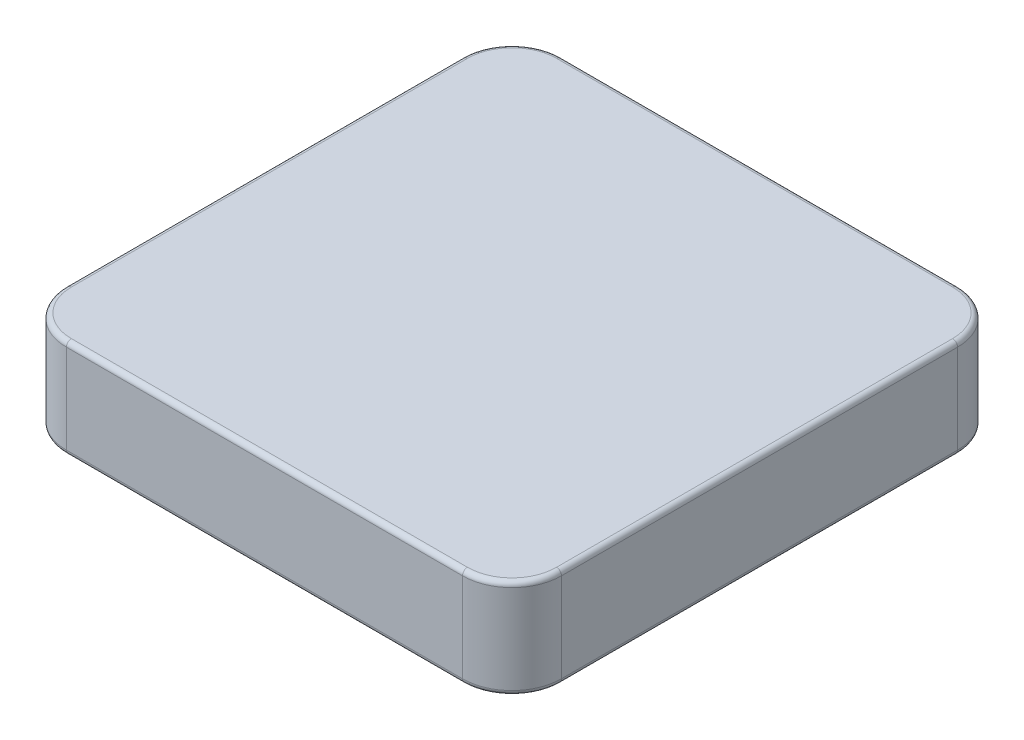
ISO-10303-21;
HEADER;
FILE_DESCRIPTION(('STEP AP214'),'2;1');
FILE_NAME('part.step','',(''),(''),'','','');
FILE_SCHEMA(('AUTOMOTIVE_DESIGN { 1 0 10303 214 1 1 1 1 }'));
ENDSEC;
DATA;
#1=APPLICATION_CONTEXT('core data for automotive mechanical design processes');
#2=APPLICATION_PROTOCOL_DEFINITION('international standard','automotive_design',2000,#1);
#3=PRODUCT_CONTEXT('',#1,'mechanical');
#4=PRODUCT('Part','Part','',(#3));
#5=PRODUCT_RELATED_PRODUCT_CATEGORY('part','',(#4));
#6=PRODUCT_DEFINITION_FORMATION('','',#4);
#7=PRODUCT_DEFINITION_CONTEXT('part definition',#1,'design');
#8=PRODUCT_DEFINITION('design','',#6,#7);
#9=PRODUCT_DEFINITION_SHAPE('','',#8);
#10=(LENGTH_UNIT() NAMED_UNIT(*) SI_UNIT(.MILLI.,.METRE.));
#11=(NAMED_UNIT(*) PLANE_ANGLE_UNIT() SI_UNIT($,.RADIAN.));
#12=(NAMED_UNIT(*) SI_UNIT($,.STERADIAN.) SOLID_ANGLE_UNIT());
#13=UNCERTAINTY_MEASURE_WITH_UNIT(LENGTH_MEASURE(1.E-05),#10,'distance_accuracy_value','');
#14=(GEOMETRIC_REPRESENTATION_CONTEXT(3) GLOBAL_UNCERTAINTY_ASSIGNED_CONTEXT((#13)) GLOBAL_UNIT_ASSIGNED_CONTEXT((#10,
#11,#12)) REPRESENTATION_CONTEXT('',''));
#15=CARTESIAN_POINT('',(0.,0.,0.));
#16=DIRECTION('',(0.,0.,1.));
#17=DIRECTION('',(1.,0.,0.));
#18=AXIS2_PLACEMENT_3D('',#15,#16,#17);
#19=CARTESIAN_POINT('',(9.99999999999997,10.0000000000002,89.9999999999999));
#20=DIRECTION('',(0.,-0.999999999999999,0.));
#21=DIRECTION('',(0.,0.,-0.999999999999999));
#22=AXIS2_PLACEMENT_3D('',#19,#20,#21);
#23=CYLINDRICAL_SURFACE('',#22,10.);
#24=DIRECTION('',(0.,-0.999999999999999,0.));
#25=VECTOR('',#24,1.);
#26=CARTESIAN_POINT('',(10.0000000000001,9.99999999999997,100.));
#27=LINE('',#26,#25);
#28=CARTESIAN_POINT('',(10.0000000000001,8.99999999999996,100.));
#29=VERTEX_POINT('',#28);
#30=CARTESIAN_POINT('',(10.0000000000001,-8.99999999999998,100.));
#31=VERTEX_POINT('',#30);
#32=EDGE_CURVE('E199',#29,#31,#27,.T.);
#33=ORIENTED_EDGE('',*,*,#32,.F.);
#34=CARTESIAN_POINT('',(9.99999999999999,9.00000000000004,90.));
#35=DIRECTION('',(0.,-0.999999999999999,0.));
#36=DIRECTION('',(0.,0.,-0.999999999999999));
#37=AXIS2_PLACEMENT_3D('',#34,#35,#36);
#38=CIRCLE('',#37,10.);
#39=CARTESIAN_POINT('',(0.,9.00000000000001,89.9999999999999));
#40=VERTEX_POINT('',#39);
#41=EDGE_CURVE('E271',#29,#40,#38,.T.);
#42=ORIENTED_EDGE('',*,*,#41,.T.);
#43=DIRECTION('',(0.,-0.999999999999999,0.));
#44=VECTOR('',#43,1.);
#45=CARTESIAN_POINT('',(0.,10.,89.9999999999999));
#46=LINE('',#45,#44);
#47=CARTESIAN_POINT('',(0.,-8.99999999999995,89.9999999999999));
#48=VERTEX_POINT('',#47);
#49=EDGE_CURVE('E251',#40,#48,#46,.T.);
#50=ORIENTED_EDGE('',*,*,#49,.T.);
#51=CARTESIAN_POINT('',(10.,-8.99999999999988,90.));
#52=DIRECTION('',(0.,-0.999999999999999,0.));
#53=DIRECTION('',(0.,0.,-0.999999999999999));
#54=AXIS2_PLACEMENT_3D('',#51,#52,#53);
#55=CIRCLE('',#54,10.);
#56=EDGE_CURVE('E220',#48,#31,#55,.F.);
#57=ORIENTED_EDGE('',*,*,#56,.T.);
#58=EDGE_LOOP('',(#33,#42,#50,#57));
#59=FACE_BOUND('',#58,.T.);
#60=ADVANCED_FACE('F51',(#59),#23,.T.);
#61=CARTESIAN_POINT('',(10.0000000000001,9.99999999999997,100.));
#62=DIRECTION('',(0.,0.,-0.999999999999999));
#63=DIRECTION('',(-0.999999999999999,0.,0.));
#64=AXIS2_PLACEMENT_3D('',#61,#62,#63);
#65=PLANE('',#64);
#66=DIRECTION('',(0.,-0.999999999999999,0.));
#67=VECTOR('',#66,1.);
#68=CARTESIAN_POINT('',(89.9999999999999,9.99999999999999,100.));
#69=LINE('',#68,#67);
#70=CARTESIAN_POINT('',(89.9999999999998,9.00000000000014,100.));
#71=VERTEX_POINT('',#70);
#72=CARTESIAN_POINT('',(89.9999999999998,-9.,100.));
#73=VERTEX_POINT('',#72);
#74=EDGE_CURVE('E172',#71,#73,#69,.T.);
#75=ORIENTED_EDGE('',*,*,#74,.F.);
#76=DIRECTION('',(0.999999999999999,0.,0.));
#77=VECTOR('',#76,1.);
#78=CARTESIAN_POINT('',(10.0000000000001,8.99999999999996,100.));
#79=LINE('',#78,#77);
#80=EDGE_CURVE('E268',#71,#29,#79,.F.);
#81=ORIENTED_EDGE('',*,*,#80,.T.);
#82=ORIENTED_EDGE('',*,*,#32,.T.);
#83=DIRECTION('',(0.999999999999999,0.,0.));
#84=VECTOR('',#83,1.);
#85=CARTESIAN_POINT('',(89.9999999999998,-9.,100.));
#86=LINE('',#85,#84);
#87=EDGE_CURVE('E218',#31,#73,#86,.T.);
#88=ORIENTED_EDGE('',*,*,#87,.T.);
#89=EDGE_LOOP('',(#75,#81,#82,#88));
#90=FACE_BOUND('',#89,.T.);
#91=ADVANCED_FACE('F348',(#90),#65,.F.);
#92=CARTESIAN_POINT('',(89.9999999999999,10.0000000000001,90.));
#93=DIRECTION('',(0.,-0.999999999999999,0.));
#94=DIRECTION('',(0.,0.,-0.999999999999999));
#95=AXIS2_PLACEMENT_3D('',#92,#93,#94);
#96=CYLINDRICAL_SURFACE('',#95,9.99999999999999);
#97=DIRECTION('',(0.,-0.999999999999999,0.));
#98=VECTOR('',#97,1.);
#99=CARTESIAN_POINT('',(99.9999999999999,9.99999999999995,89.9999999999998));
#100=LINE('',#99,#98);
#101=CARTESIAN_POINT('',(99.9999999999999,9.00000000000001,89.9999999999999));
#102=VERTEX_POINT('',#101);
#103=CARTESIAN_POINT('',(99.9999999999999,-8.99999999999999,89.9999999999999));
#104=VERTEX_POINT('',#103);
#105=EDGE_CURVE('E163',#102,#104,#100,.T.);
#106=ORIENTED_EDGE('',*,*,#105,.F.);
#107=CARTESIAN_POINT('',(89.9999999999999,9.00000000000011,89.9999999999998));
#108=DIRECTION('',(0.,-0.999999999999999,0.));
#109=DIRECTION('',(0.,0.,-0.999999999999999));
#110=AXIS2_PLACEMENT_3D('',#107,#108,#109);
#111=CIRCLE('',#110,9.99999999999999);
#112=EDGE_CURVE('E13',#102,#71,#111,.T.);
#113=ORIENTED_EDGE('',*,*,#112,.T.);
#114=ORIENTED_EDGE('',*,*,#74,.T.);
#115=CARTESIAN_POINT('',(90.,-8.99999999999997,89.9999999999998));
#116=DIRECTION('',(0.,-0.999999999999999,0.));
#117=DIRECTION('',(0.,0.,-0.999999999999999));
#118=AXIS2_PLACEMENT_3D('',#115,#116,#117);
#119=CIRCLE('',#118,9.99999999999999);
#120=EDGE_CURVE('E181',#73,#104,#119,.F.);
#121=ORIENTED_EDGE('',*,*,#120,.T.);
#122=EDGE_LOOP('',(#106,#113,#114,#121));
#123=FACE_BOUND('',#122,.T.);
#124=ADVANCED_FACE('F195',(#123),#96,.T.);
#125=CARTESIAN_POINT('',(99.9999999999999,10.0000000000002,10.0000000000001));
#126=DIRECTION('',(-0.999999999999999,0.,0.));
#127=DIRECTION('',(0.,0.,0.999999999999999));
#128=AXIS2_PLACEMENT_3D('',#125,#126,#127);
#129=PLANE('',#128);
#130=DIRECTION('',(0.,-0.999999999999999,0.));
#131=VECTOR('',#130,1.);
#132=CARTESIAN_POINT('',(99.9999999999999,10.0000000000002,10.0000000000001));
#133=LINE('',#132,#131);
#134=CARTESIAN_POINT('',(99.9999999999999,9.00000000000006,10.0000000000001));
#135=VERTEX_POINT('',#134);
#136=CARTESIAN_POINT('',(99.9999999999998,-8.99999999999987,10.0000000000001));
#137=VERTEX_POINT('',#136);
#138=EDGE_CURVE('E173',#135,#137,#133,.T.);
#139=ORIENTED_EDGE('',*,*,#138,.F.);
#140=DIRECTION('',(0.,0.,-0.999999999999999));
#141=VECTOR('',#140,1.);
#142=CARTESIAN_POINT('',(99.9999999999999,9.00000000000006,10.0000000000001));
#143=LINE('',#142,#141);
#144=EDGE_CURVE('E60',#135,#102,#143,.F.);
#145=ORIENTED_EDGE('',*,*,#144,.T.);
#146=ORIENTED_EDGE('',*,*,#105,.T.);
#147=DIRECTION('',(0.,0.,-0.999999999999999));
#148=VECTOR('',#147,1.);
#149=CARTESIAN_POINT('',(99.9999999999998,-8.99999999999987,10.0000000000001));
#150=LINE('',#149,#148);
#151=EDGE_CURVE('E167',#104,#137,#150,.T.);
#152=ORIENTED_EDGE('',*,*,#151,.T.);
#153=EDGE_LOOP('',(#139,#145,#146,#152));
#154=FACE_BOUND('',#153,.T.);
#155=ADVANCED_FACE('F165',(#154),#129,.F.);
#156=CARTESIAN_POINT('',(89.9999999999999,10.,10.));
#157=DIRECTION('',(0.,-0.999999999999999,0.));
#158=DIRECTION('',(0.,0.,-0.999999999999999));
#159=AXIS2_PLACEMENT_3D('',#156,#157,#158);
#160=CYLINDRICAL_SURFACE('',#159,10.);
#161=DIRECTION('',(0.,-0.999999999999999,0.));
#162=VECTOR('',#161,1.);
#163=CARTESIAN_POINT('',(89.9999999999998,10.0000000000001,0.));
#164=LINE('',#163,#162);
#165=CARTESIAN_POINT('',(89.9999999999999,9.00000000000006,0.));
#166=VERTEX_POINT('',#165);
#167=CARTESIAN_POINT('',(89.9999999999998,-8.99999999999981,0.));
#168=VERTEX_POINT('',#167);
#169=EDGE_CURVE('E314',#166,#168,#164,.T.);
#170=ORIENTED_EDGE('',*,*,#169,.F.);
#171=CARTESIAN_POINT('',(89.9999999999999,9.00000000000004,9.99999999999998));
#172=DIRECTION('',(0.,-0.999999999999999,0.));
#173=DIRECTION('',(0.,0.,-0.999999999999999));
#174=AXIS2_PLACEMENT_3D('',#171,#172,#173);
#175=CIRCLE('',#174,10.);
#176=EDGE_CURVE('E75',#166,#135,#175,.T.);
#177=ORIENTED_EDGE('',*,*,#176,.T.);
#178=ORIENTED_EDGE('',*,*,#138,.T.);
#179=CARTESIAN_POINT('',(89.9999999999999,-8.99999999999984,10.));
#180=DIRECTION('',(0.,-0.999999999999999,0.));
#181=DIRECTION('',(0.,0.,-0.999999999999999));
#182=AXIS2_PLACEMENT_3D('',#179,#180,#181);
#183=CIRCLE('',#182,10.);
#184=EDGE_CURVE('E193',#137,#168,#183,.F.);
#185=ORIENTED_EDGE('',*,*,#184,.T.);
#186=EDGE_LOOP('',(#170,#177,#178,#185));
#187=FACE_BOUND('',#186,.T.);
#188=ADVANCED_FACE('F316',(#187),#160,.T.);
#189=CARTESIAN_POINT('',(10.0000000000001,10.,0.));
#190=DIRECTION('',(0.,0.,0.999999999999999));
#191=DIRECTION('',(0.999999999999999,0.,0.));
#192=AXIS2_PLACEMENT_3D('',#189,#190,#191);
#193=PLANE('',#192);
#194=DIRECTION('',(0.,-0.999999999999999,0.));
#195=VECTOR('',#194,1.);
#196=CARTESIAN_POINT('',(10.0000000000001,10.,0.));
#197=LINE('',#196,#195);
#198=CARTESIAN_POINT('',(10.0000000000001,9.,0.));
#199=VERTEX_POINT('',#198);
#200=CARTESIAN_POINT('',(10.,-8.99999999999993,0.));
#201=VERTEX_POINT('',#200);
#202=EDGE_CURVE('E315',#199,#201,#197,.T.);
#203=ORIENTED_EDGE('',*,*,#202,.F.);
#204=DIRECTION('',(-0.999999999999999,0.,0.));
#205=VECTOR('',#204,1.);
#206=CARTESIAN_POINT('',(10.0000000000001,9.,0.));
#207=LINE('',#206,#205);
#208=EDGE_CURVE('E277',#199,#166,#207,.F.);
#209=ORIENTED_EDGE('',*,*,#208,.T.);
#210=ORIENTED_EDGE('',*,*,#169,.T.);
#211=DIRECTION('',(-0.999999999999999,0.,0.));
#212=VECTOR('',#211,1.);
#213=CARTESIAN_POINT('',(10.,-8.99999999999993,0.));
#214=LINE('',#213,#212);
#215=EDGE_CURVE('E229',#168,#201,#214,.T.);
#216=ORIENTED_EDGE('',*,*,#215,.T.);
#217=EDGE_LOOP('',(#203,#209,#210,#216));
#218=FACE_BOUND('',#217,.T.);
#219=ADVANCED_FACE('F313',(#218),#193,.F.);
#220=CARTESIAN_POINT('',(10.,10.0000000000001,10.));
#221=DIRECTION('',(0.,-0.999999999999999,0.));
#222=DIRECTION('',(0.,0.,-0.999999999999999));
#223=AXIS2_PLACEMENT_3D('',#220,#221,#222);
#224=CYLINDRICAL_SURFACE('',#223,10.);
#225=DIRECTION('',(0.,-0.999999999999999,0.));
#226=VECTOR('',#225,1.);
#227=CARTESIAN_POINT('',(0.,10.,10.0000000000001));
#228=LINE('',#227,#226);
#229=CARTESIAN_POINT('',(0.,9.00000000000001,10.0000000000001));
#230=VERTEX_POINT('',#229);
#231=CARTESIAN_POINT('',(0.,-8.99999999999988,10.0000000000001));
#232=VERTEX_POINT('',#231);
#233=EDGE_CURVE('E320',#230,#232,#228,.T.);
#234=ORIENTED_EDGE('',*,*,#233,.F.);
#235=CARTESIAN_POINT('',(9.99999999999999,9.,10.));
#236=DIRECTION('',(0.,-0.999999999999999,0.));
#237=DIRECTION('',(0.,0.,-0.999999999999999));
#238=AXIS2_PLACEMENT_3D('',#235,#236,#237);
#239=CIRCLE('',#238,10.);
#240=EDGE_CURVE('E275',#230,#199,#239,.T.);
#241=ORIENTED_EDGE('',*,*,#240,.T.);
#242=ORIENTED_EDGE('',*,*,#202,.T.);
#243=CARTESIAN_POINT('',(9.99999999999999,-8.99999999999993,10.0000000000001));
#244=DIRECTION('',(0.,-0.999999999999999,0.));
#245=DIRECTION('',(0.,0.,-0.999999999999999));
#246=AXIS2_PLACEMENT_3D('',#243,#244,#245);
#247=CIRCLE('',#246,10.);
#248=EDGE_CURVE('E226',#201,#232,#247,.F.);
#249=ORIENTED_EDGE('',*,*,#248,.T.);
#250=EDGE_LOOP('',(#234,#241,#242,#249));
#251=FACE_BOUND('',#250,.T.);
#252=ADVANCED_FACE('F370',(#251),#224,.T.);
#253=CARTESIAN_POINT('',(0.,10.0000000000001,10.));
#254=DIRECTION('',(0.999999999999999,0.,0.));
#255=DIRECTION('',(0.,0.,-0.999999999999999));
#256=AXIS2_PLACEMENT_3D('',#253,#254,#255);
#257=PLANE('',#256);
#258=ORIENTED_EDGE('',*,*,#49,.F.);
#259=DIRECTION('',(0.,0.,0.999999999999999));
#260=VECTOR('',#259,1.);
#261=CARTESIAN_POINT('',(0.,9.00000000000001,10.0000000000001));
#262=LINE('',#261,#260);
#263=EDGE_CURVE('E273',#40,#230,#262,.F.);
#264=ORIENTED_EDGE('',*,*,#263,.T.);
#265=ORIENTED_EDGE('',*,*,#233,.T.);
#266=DIRECTION('',(0.,0.,0.999999999999999));
#267=VECTOR('',#266,1.);
#268=CARTESIAN_POINT('',(0.,-8.99999999999995,89.9999999999999));
#269=LINE('',#268,#267);
#270=EDGE_CURVE('E223',#232,#48,#269,.T.);
#271=ORIENTED_EDGE('',*,*,#270,.T.);
#272=EDGE_LOOP('',(#258,#264,#265,#271));
#273=FACE_BOUND('',#272,.T.);
#274=ADVANCED_FACE('F334',(#273),#257,.F.);
#275=CARTESIAN_POINT('',(9.99999999999997,10.0000000000002,89.9999999999999));
#276=DIRECTION('',(0.,-0.999999999999999,0.));
#277=DIRECTION('',(0.,0.,-0.999999999999999));
#278=AXIS2_PLACEMENT_3D('',#275,#276,#277);
#279=PLANE('',#278);
#280=CARTESIAN_POINT('',(9.99999999999997,10.0000000000002,89.9999999999999));
#281=DIRECTION('',(0.,-0.999999999999999,0.));
#282=DIRECTION('',(0.,0.,-0.999999999999999));
#283=AXIS2_PLACEMENT_3D('',#280,#281,#282);
#284=CIRCLE('',#283,9.);
#285=CARTESIAN_POINT('',(0.999999999999945,10.0000000000002,89.9999999999997));
#286=VERTEX_POINT('',#285);
#287=CARTESIAN_POINT('',(10.0000000000001,9.99999999999997,99.));
#288=VERTEX_POINT('',#287);
#289=EDGE_CURVE('E263',#286,#288,#284,.F.);
#290=ORIENTED_EDGE('',*,*,#289,.T.);
#291=DIRECTION('',(0.999999999999999,0.,0.));
#292=VECTOR('',#291,1.);
#293=CARTESIAN_POINT('',(9.99999999999997,10.0000000000001,98.9999999999997));
#294=LINE('',#293,#292);
#295=CARTESIAN_POINT('',(89.9999999999998,10.,99.));
#296=VERTEX_POINT('',#295);
#297=EDGE_CURVE('E265',#288,#296,#294,.T.);
#298=ORIENTED_EDGE('',*,*,#297,.T.);
#299=CARTESIAN_POINT('',(89.9999999999999,10.0000000000001,90.));
#300=DIRECTION('',(0.,-0.999999999999999,0.));
#301=DIRECTION('',(0.,0.,-0.999999999999999));
#302=AXIS2_PLACEMENT_3D('',#299,#300,#301);
#303=CIRCLE('',#302,8.99999999999999);
#304=CARTESIAN_POINT('',(98.9999999999999,10.0000000000001,89.9999999999998));
#305=VERTEX_POINT('',#304);
#306=EDGE_CURVE('E192',#296,#305,#303,.F.);
#307=ORIENTED_EDGE('',*,*,#306,.T.);
#308=DIRECTION('',(0.,0.,-0.999999999999999));
#309=VECTOR('',#308,1.);
#310=CARTESIAN_POINT('',(98.9999999999998,10.0000000000001,89.9999999999999));
#311=LINE('',#310,#309);
#312=CARTESIAN_POINT('',(98.9999999999999,9.99999999999998,10.0000000000001));
#313=VERTEX_POINT('',#312);
#314=EDGE_CURVE('E253',#305,#313,#311,.T.);
#315=ORIENTED_EDGE('',*,*,#314,.T.);
#316=CARTESIAN_POINT('',(89.9999999999999,10.,10.));
#317=DIRECTION('',(0.,-0.999999999999999,0.));
#318=DIRECTION('',(0.,0.,-0.999999999999999));
#319=AXIS2_PLACEMENT_3D('',#316,#317,#318);
#320=CIRCLE('',#319,9.);
#321=CARTESIAN_POINT('',(89.9999999999999,10.0000000000001,1.00000000000003));
#322=VERTEX_POINT('',#321);
#323=EDGE_CURVE('E255',#313,#322,#320,.F.);
#324=ORIENTED_EDGE('',*,*,#323,.T.);
#325=DIRECTION('',(-0.999999999999999,0.,0.));
#326=VECTOR('',#325,1.);
#327=CARTESIAN_POINT('',(10.,10.0000000000001,1.));
#328=LINE('',#327,#326);
#329=CARTESIAN_POINT('',(10.0000000000001,10.0000000000001,1.));
#330=VERTEX_POINT('',#329);
#331=EDGE_CURVE('E257',#322,#330,#328,.T.);
#332=ORIENTED_EDGE('',*,*,#331,.T.);
#333=CARTESIAN_POINT('',(10.,10.0000000000001,10.));
#334=DIRECTION('',(0.,-0.999999999999999,0.));
#335=DIRECTION('',(0.,0.,-0.999999999999999));
#336=AXIS2_PLACEMENT_3D('',#333,#334,#335);
#337=CIRCLE('',#336,9.);
#338=CARTESIAN_POINT('',(1.00000000000001,10.,10.0000000000001));
#339=VERTEX_POINT('',#338);
#340=EDGE_CURVE('E259',#330,#339,#337,.F.);
#341=ORIENTED_EDGE('',*,*,#340,.T.);
#342=DIRECTION('',(0.,0.,0.999999999999999));
#343=VECTOR('',#342,1.);
#344=CARTESIAN_POINT('',(0.999999999999945,10.,89.9999999999999));
#345=LINE('',#344,#343);
#346=EDGE_CURVE('E261',#339,#286,#345,.T.);
#347=ORIENTED_EDGE('',*,*,#346,.T.);
#348=EDGE_LOOP('',(#290,#298,#307,#315,#324,#332,#341,#347));
#349=FACE_BOUND('',#348,.T.);
#350=ADVANCED_FACE('F361',(#349),#279,.F.);
#351=CARTESIAN_POINT('',(10.,-9.99999999999986,90.));
#352=DIRECTION('',(0.,-0.999999999999999,0.));
#353=DIRECTION('',(0.,0.,-0.999999999999999));
#354=AXIS2_PLACEMENT_3D('',#351,#352,#353);
#355=PLANE('',#354);
#356=DIRECTION('',(0.,0.,-0.999999999999999));
#357=VECTOR('',#356,1.);
#358=CARTESIAN_POINT('',(98.9999999999999,-9.99999999999986,89.9999999999999));
#359=LINE('',#358,#357);
#360=CARTESIAN_POINT('',(98.9999999999999,-9.99999999999984,10.0000000000001));
#361=VERTEX_POINT('',#360);
#362=CARTESIAN_POINT('',(98.9999999999999,-9.99999999999986,89.9999999999999));
#363=VERTEX_POINT('',#362);
#364=EDGE_CURVE('E198',#361,#363,#359,.F.);
#365=ORIENTED_EDGE('',*,*,#364,.T.);
#366=CARTESIAN_POINT('',(89.9999999999998,-9.99999999999995,90.0000000000001));
#367=DIRECTION('',(0.,-0.999999999999999,0.));
#368=DIRECTION('',(0.,0.,-0.999999999999999));
#369=AXIS2_PLACEMENT_3D('',#366,#367,#368);
#370=CIRCLE('',#369,8.99999999999999);
#371=CARTESIAN_POINT('',(89.9999999999998,-9.99999999999993,98.9999999999999));
#372=VERTEX_POINT('',#371);
#373=EDGE_CURVE('E183',#363,#372,#370,.T.);
#374=ORIENTED_EDGE('',*,*,#373,.T.);
#375=DIRECTION('',(0.999999999999999,0.,0.));
#376=VECTOR('',#375,1.);
#377=CARTESIAN_POINT('',(10.,-9.99999999999996,99.));
#378=LINE('',#377,#376);
#379=CARTESIAN_POINT('',(10.,-9.99999999999996,99.));
#380=VERTEX_POINT('',#379);
#381=EDGE_CURVE('E215',#372,#380,#378,.F.);
#382=ORIENTED_EDGE('',*,*,#381,.T.);
#383=CARTESIAN_POINT('',(10.,-9.99999999999986,90.));
#384=DIRECTION('',(0.,-0.999999999999999,0.));
#385=DIRECTION('',(0.,0.,-0.999999999999999));
#386=AXIS2_PLACEMENT_3D('',#383,#384,#385);
#387=CIRCLE('',#386,9.);
#388=CARTESIAN_POINT('',(1.00000000000008,-9.99999999999999,89.9999999999999));
#389=VERTEX_POINT('',#388);
#390=EDGE_CURVE('E213',#380,#389,#387,.T.);
#391=ORIENTED_EDGE('',*,*,#390,.T.);
#392=DIRECTION('',(0.,0.,0.999999999999999));
#393=VECTOR('',#392,1.);
#394=CARTESIAN_POINT('',(1.00000000000001,-9.9999999999999,10.0000000000001));
#395=LINE('',#394,#393);
#396=CARTESIAN_POINT('',(1.00000000000001,-9.9999999999999,10.0000000000001));
#397=VERTEX_POINT('',#396);
#398=EDGE_CURVE('E211',#389,#397,#395,.F.);
#399=ORIENTED_EDGE('',*,*,#398,.T.);
#400=CARTESIAN_POINT('',(9.99999999999997,-9.9999999999999,9.99999999999993));
#401=DIRECTION('',(0.,-0.999999999999999,0.));
#402=DIRECTION('',(0.,0.,-0.999999999999999));
#403=AXIS2_PLACEMENT_3D('',#400,#401,#402);
#404=CIRCLE('',#403,9.);
#405=CARTESIAN_POINT('',(10.0000000000001,-9.99999999999987,1.));
#406=VERTEX_POINT('',#405);
#407=EDGE_CURVE('E209',#397,#406,#404,.T.);
#408=ORIENTED_EDGE('',*,*,#407,.T.);
#409=DIRECTION('',(-0.999999999999999,0.,0.));
#410=VECTOR('',#409,1.);
#411=CARTESIAN_POINT('',(89.9999999999998,-9.99999999999995,1.00000000000003));
#412=LINE('',#411,#410);
#413=CARTESIAN_POINT('',(89.9999999999998,-9.99999999999995,1.00000000000003));
#414=VERTEX_POINT('',#413);
#415=EDGE_CURVE('E207',#406,#414,#412,.F.);
#416=ORIENTED_EDGE('',*,*,#415,.T.);
#417=CARTESIAN_POINT('',(90.,-10.,10.));
#418=DIRECTION('',(0.,-0.999999999999999,0.));
#419=DIRECTION('',(0.,0.,-0.999999999999999));
#420=AXIS2_PLACEMENT_3D('',#417,#418,#419);
#421=CIRCLE('',#420,9.);
#422=EDGE_CURVE('E201',#414,#361,#421,.T.);
#423=ORIENTED_EDGE('',*,*,#422,.T.);
#424=EDGE_LOOP('',(#365,#374,#382,#391,#399,#408,#416,#423));
#425=FACE_BOUND('',#424,.T.);
#426=ADVANCED_FACE('F379',(#425),#355,.T.);
#427=CARTESIAN_POINT('',(9.99999999999999,-8.99999999999993,10.0000000000001));
#428=DIRECTION('',(0.,-0.999999999999999,0.));
#429=DIRECTION('',(0.,0.,-0.999999999999999));
#430=AXIS2_PLACEMENT_3D('',#427,#428,#429);
#431=TOROIDAL_SURFACE('',#430,9.,1.);
#432=CARTESIAN_POINT('',(10.0000000000001,-8.99999999999998,1.));
#433=DIRECTION('',(0.999999999999999,0.,0.));
#434=DIRECTION('',(0.,0.,-1.));
#435=AXIS2_PLACEMENT_3D('',#432,#433,#434);
#436=CIRCLE('',#435,1.);
#437=EDGE_CURVE('E245',#406,#201,#436,.T.);
#438=ORIENTED_EDGE('',*,*,#437,.F.);
#439=ORIENTED_EDGE('',*,*,#407,.F.);
#440=CARTESIAN_POINT('',(0.999999999999945,-8.99999999999998,10.0000000000001));
#441=DIRECTION('',(0.,0.,1.));
#442=DIRECTION('',(0.,-0.999999999999999,0.));
#443=AXIS2_PLACEMENT_3D('',#440,#441,#442);
#444=CIRCLE('',#443,1.);
#445=EDGE_CURVE('E248',#232,#397,#444,.T.);
#446=ORIENTED_EDGE('',*,*,#445,.F.);
#447=ORIENTED_EDGE('',*,*,#248,.F.);
#448=EDGE_LOOP('',(#438,#439,#446,#447));
#449=FACE_BOUND('',#448,.T.);
#450=ADVANCED_FACE('F376',(#449),#431,.T.);
#451=CARTESIAN_POINT('',(0.999999999999945,-8.99999999999998,10.0000000000001));
#452=DIRECTION('',(0.,0.,-0.999999999999999));
#453=DIRECTION('',(-0.999999999999999,0.,0.));
#454=AXIS2_PLACEMENT_3D('',#451,#452,#453);
#455=CYLINDRICAL_SURFACE('',#454,1.);
#456=ORIENTED_EDGE('',*,*,#445,.T.);
#457=ORIENTED_EDGE('',*,*,#398,.F.);
#458=CARTESIAN_POINT('',(1.00000000000001,-8.9999999999999,90.));
#459=DIRECTION('',(0.,0.,0.999999999999999));
#460=DIRECTION('',(0.,-1.,0.));
#461=AXIS2_PLACEMENT_3D('',#458,#459,#460);
#462=CIRCLE('',#461,1.);
#463=EDGE_CURVE('E242',#48,#389,#462,.T.);
#464=ORIENTED_EDGE('',*,*,#463,.F.);
#465=ORIENTED_EDGE('',*,*,#270,.F.);
#466=EDGE_LOOP('',(#456,#457,#464,#465));
#467=FACE_BOUND('',#466,.T.);
#468=ADVANCED_FACE('F338',(#467),#455,.T.);
#469=CARTESIAN_POINT('',(10.0000000000001,-8.99999999999998,1.));
#470=DIRECTION('',(0.999999999999999,0.,0.));
#471=DIRECTION('',(0.,0.,-0.999999999999999));
#472=AXIS2_PLACEMENT_3D('',#469,#470,#471);
#473=CYLINDRICAL_SURFACE('',#472,1.);
#474=ORIENTED_EDGE('',*,*,#437,.T.);
#475=ORIENTED_EDGE('',*,*,#215,.F.);
#476=CARTESIAN_POINT('',(89.9999999999998,-8.99999999999993,1.00000000000003));
#477=DIRECTION('',(0.999999999999999,0.,0.));
#478=DIRECTION('',(0.,0.,-0.999999999999999));
#479=AXIS2_PLACEMENT_3D('',#476,#477,#478);
#480=CIRCLE('',#479,1.);
#481=EDGE_CURVE('E239',#414,#168,#480,.T.);
#482=ORIENTED_EDGE('',*,*,#481,.F.);
#483=ORIENTED_EDGE('',*,*,#415,.F.);
#484=EDGE_LOOP('',(#474,#475,#482,#483));
#485=FACE_BOUND('',#484,.T.);
#486=ADVANCED_FACE('F385',(#485),#473,.T.);
#487=CARTESIAN_POINT('',(10.,-8.99999999999988,90.));
#488=DIRECTION('',(0.,-0.999999999999999,0.));
#489=DIRECTION('',(0.,0.,-0.999999999999999));
#490=AXIS2_PLACEMENT_3D('',#487,#488,#489);
#491=TOROIDAL_SURFACE('',#490,9.,1.);
#492=ORIENTED_EDGE('',*,*,#463,.T.);
#493=ORIENTED_EDGE('',*,*,#390,.F.);
#494=CARTESIAN_POINT('',(10.0000000000001,-8.99999999999999,99.));
#495=DIRECTION('',(1.,0.,0.));
#496=DIRECTION('',(0.,0.999999999999999,0.));
#497=AXIS2_PLACEMENT_3D('',#494,#495,#496);
#498=CIRCLE('',#497,1.);
#499=EDGE_CURVE('E236',#31,#380,#498,.T.);
#500=ORIENTED_EDGE('',*,*,#499,.F.);
#501=ORIENTED_EDGE('',*,*,#56,.F.);
#502=EDGE_LOOP('',(#492,#493,#500,#501));
#503=FACE_BOUND('',#502,.T.);
#504=ADVANCED_FACE('F341',(#503),#491,.T.);
#505=CARTESIAN_POINT('',(89.9999999999999,-8.99999999999984,10.));
#506=DIRECTION('',(0.,-0.999999999999999,0.));
#507=DIRECTION('',(0.,0.,-0.999999999999999));
#508=AXIS2_PLACEMENT_3D('',#505,#506,#507);
#509=TOROIDAL_SURFACE('',#508,9.,1.);
#510=ORIENTED_EDGE('',*,*,#481,.T.);
#511=ORIENTED_EDGE('',*,*,#184,.F.);
#512=CARTESIAN_POINT('',(99.,-8.99999999999998,10.0000000000001));
#513=DIRECTION('',(0.,0.,1.));
#514=DIRECTION('',(0.999999999999999,0.,0.));
#515=AXIS2_PLACEMENT_3D('',#512,#513,#514);
#516=CIRCLE('',#515,1.);
#517=EDGE_CURVE('E191',#361,#137,#516,.T.);
#518=ORIENTED_EDGE('',*,*,#517,.F.);
#519=ORIENTED_EDGE('',*,*,#422,.F.);
#520=EDGE_LOOP('',(#510,#511,#518,#519));
#521=FACE_BOUND('',#520,.T.);
#522=ADVANCED_FACE('F383',(#521),#509,.T.);
#523=CARTESIAN_POINT('',(10.0000000000001,-8.99999999999999,99.));
#524=DIRECTION('',(-0.999999999999999,0.,0.));
#525=DIRECTION('',(0.,0.,0.999999999999999));
#526=AXIS2_PLACEMENT_3D('',#523,#524,#525);
#527=CYLINDRICAL_SURFACE('',#526,1.);
#528=ORIENTED_EDGE('',*,*,#499,.T.);
#529=ORIENTED_EDGE('',*,*,#381,.F.);
#530=CARTESIAN_POINT('',(89.9999999999998,-8.99999999999993,99.));
#531=DIRECTION('',(0.999999999999999,0.,0.));
#532=DIRECTION('',(0.,1.,0.));
#533=AXIS2_PLACEMENT_3D('',#530,#531,#532);
#534=CIRCLE('',#533,1.);
#535=EDGE_CURVE('E186',#73,#372,#534,.T.);
#536=ORIENTED_EDGE('',*,*,#535,.F.);
#537=ORIENTED_EDGE('',*,*,#87,.F.);
#538=EDGE_LOOP('',(#528,#529,#536,#537));
#539=FACE_BOUND('',#538,.T.);
#540=ADVANCED_FACE('F346',(#539),#527,.T.);
#541=CARTESIAN_POINT('',(99.,-8.99999999999998,10.0000000000001));
#542=DIRECTION('',(0.,0.,0.999999999999999));
#543=DIRECTION('',(0.999999999999999,0.,0.));
#544=AXIS2_PLACEMENT_3D('',#541,#542,#543);
#545=CYLINDRICAL_SURFACE('',#544,1.);
#546=ORIENTED_EDGE('',*,*,#517,.T.);
#547=ORIENTED_EDGE('',*,*,#151,.F.);
#548=CARTESIAN_POINT('',(98.9999999999999,-8.99999999999999,89.9999999999998));
#549=DIRECTION('',(0.,0.,0.999999999999999));
#550=DIRECTION('',(1.,0.,0.));
#551=AXIS2_PLACEMENT_3D('',#548,#549,#550);
#552=CIRCLE('',#551,1.);
#553=EDGE_CURVE('E179',#363,#104,#552,.T.);
#554=ORIENTED_EDGE('',*,*,#553,.F.);
#555=ORIENTED_EDGE('',*,*,#364,.F.);
#556=EDGE_LOOP('',(#546,#547,#554,#555));
#557=FACE_BOUND('',#556,.T.);
#558=ADVANCED_FACE('F189',(#557),#545,.T.);
#559=CARTESIAN_POINT('',(90.,-8.99999999999997,89.9999999999998));
#560=DIRECTION('',(0.,-0.999999999999999,0.));
#561=DIRECTION('',(0.,0.,-0.999999999999999));
#562=AXIS2_PLACEMENT_3D('',#559,#560,#561);
#563=TOROIDAL_SURFACE('',#562,8.99999999999999,1.);
#564=ORIENTED_EDGE('',*,*,#535,.T.);
#565=ORIENTED_EDGE('',*,*,#373,.F.);
#566=ORIENTED_EDGE('',*,*,#553,.T.);
#567=ORIENTED_EDGE('',*,*,#120,.F.);
#568=EDGE_LOOP('',(#564,#565,#566,#567));
#569=FACE_BOUND('',#568,.T.);
#570=ADVANCED_FACE('F180',(#569),#563,.T.);
#571=CARTESIAN_POINT('',(9.99999999999998,9.00000000000009,1.00000000000008));
#572=DIRECTION('',(-0.999999999999999,0.,0.));
#573=DIRECTION('',(0.,0.,0.999999999999999));
#574=AXIS2_PLACEMENT_3D('',#571,#572,#573);
#575=CYLINDRICAL_SURFACE('',#574,1.);
#576=CARTESIAN_POINT('',(89.9999999999998,9.00000000000003,1.));
#577=DIRECTION('',(0.999999999999999,0.,0.));
#578=DIRECTION('',(0.,0.,-0.999999999999999));
#579=AXIS2_PLACEMENT_3D('',#576,#577,#578);
#580=CIRCLE('',#579,1.);
#581=EDGE_CURVE('E296',#166,#322,#580,.T.);
#582=ORIENTED_EDGE('',*,*,#581,.F.);
#583=ORIENTED_EDGE('',*,*,#208,.F.);
#584=CARTESIAN_POINT('',(10.,9.00000000000014,1.00000000000003));
#585=DIRECTION('',(-0.999999999999999,0.,0.));
#586=DIRECTION('',(0.,0.,1.));
#587=AXIS2_PLACEMENT_3D('',#584,#585,#586);
#588=CIRCLE('',#587,1.);
#589=EDGE_CURVE('E55',#330,#199,#588,.T.);
#590=ORIENTED_EDGE('',*,*,#589,.F.);
#591=ORIENTED_EDGE('',*,*,#331,.F.);
#592=EDGE_LOOP('',(#582,#583,#590,#591));
#593=FACE_BOUND('',#592,.T.);
#594=ADVANCED_FACE('F53',(#593),#575,.T.);
#595=CARTESIAN_POINT('',(9.99999999999999,9.,10.));
#596=DIRECTION('',(0.,-0.999999999999999,0.));
#597=DIRECTION('',(0.,0.,-0.999999999999999));
#598=AXIS2_PLACEMENT_3D('',#595,#596,#597);
#599=TOROIDAL_SURFACE('',#598,9.,1.);
#600=ORIENTED_EDGE('',*,*,#589,.T.);
#601=ORIENTED_EDGE('',*,*,#240,.F.);
#602=CARTESIAN_POINT('',(0.999999999999959,9.0000000000001,10.0000000000001));
#603=DIRECTION('',(0.,0.,0.999999999999999));
#604=DIRECTION('',(0.999999999999999,0.,0.));
#605=AXIS2_PLACEMENT_3D('',#602,#603,#604);
#606=CIRCLE('',#605,1.);
#607=EDGE_CURVE('E294',#339,#230,#606,.T.);
#608=ORIENTED_EDGE('',*,*,#607,.F.);
#609=ORIENTED_EDGE('',*,*,#340,.F.);
#610=EDGE_LOOP('',(#600,#601,#608,#609));
#611=FACE_BOUND('',#610,.T.);
#612=ADVANCED_FACE('F306',(#611),#599,.T.);
#613=CARTESIAN_POINT('',(89.9999999999999,9.00000000000004,9.99999999999998));
#614=DIRECTION('',(0.,-0.999999999999999,0.));
#615=DIRECTION('',(0.,0.,-0.999999999999999));
#616=AXIS2_PLACEMENT_3D('',#613,#614,#615);
#617=TOROIDAL_SURFACE('',#616,9.,1.);
#618=ORIENTED_EDGE('',*,*,#581,.T.);
#619=ORIENTED_EDGE('',*,*,#323,.F.);
#620=CARTESIAN_POINT('',(98.9999999999999,9.00000000000008,10.0000000000001));
#621=DIRECTION('',(0.,0.,1.));
#622=DIRECTION('',(0.999999999999999,0.,0.));
#623=AXIS2_PLACEMENT_3D('',#620,#621,#622);
#624=CIRCLE('',#623,1.);
#625=EDGE_CURVE('E291',#135,#313,#624,.T.);
#626=ORIENTED_EDGE('',*,*,#625,.F.);
#627=ORIENTED_EDGE('',*,*,#176,.F.);
#628=EDGE_LOOP('',(#618,#619,#626,#627));
#629=FACE_BOUND('',#628,.T.);
#630=ADVANCED_FACE('F436',(#629),#617,.T.);
#631=CARTESIAN_POINT('',(1.,8.99999999999999,90.));
#632=DIRECTION('',(0.,0.,0.999999999999999));
#633=DIRECTION('',(0.999999999999999,0.,0.));
#634=AXIS2_PLACEMENT_3D('',#631,#632,#633);
#635=CYLINDRICAL_SURFACE('',#634,1.);
#636=ORIENTED_EDGE('',*,*,#607,.T.);
#637=ORIENTED_EDGE('',*,*,#263,.F.);
#638=CARTESIAN_POINT('',(1.,9.00000000000003,89.9999999999999));
#639=DIRECTION('',(0.,0.,0.999999999999999));
#640=DIRECTION('',(0.999999999999999,0.,0.));
#641=AXIS2_PLACEMENT_3D('',#638,#639,#640);
#642=CIRCLE('',#641,1.);
#643=EDGE_CURVE('E288',#286,#40,#642,.T.);
#644=ORIENTED_EDGE('',*,*,#643,.F.);
#645=ORIENTED_EDGE('',*,*,#346,.F.);
#646=EDGE_LOOP('',(#636,#637,#644,#645));
#647=FACE_BOUND('',#646,.T.);
#648=ADVANCED_FACE('F368',(#647),#635,.T.);
#649=CARTESIAN_POINT('',(98.9999999999999,9.00000000000018,90.0000000000001));
#650=DIRECTION('',(0.,0.,-0.999999999999999));
#651=DIRECTION('',(-0.999999999999999,0.,0.));
#652=AXIS2_PLACEMENT_3D('',#649,#650,#651);
#653=CYLINDRICAL_SURFACE('',#652,1.);
#654=ORIENTED_EDGE('',*,*,#625,.T.);
#655=ORIENTED_EDGE('',*,*,#314,.F.);
#656=CARTESIAN_POINT('',(98.9999999999999,9.00000000000014,89.9999999999998));
#657=DIRECTION('',(0.,0.,0.999999999999999));
#658=DIRECTION('',(0.999999999999999,0.,0.));
#659=AXIS2_PLACEMENT_3D('',#656,#657,#658);
#660=CIRCLE('',#659,1.);
#661=EDGE_CURVE('E285',#102,#305,#660,.T.);
#662=ORIENTED_EDGE('',*,*,#661,.F.);
#663=ORIENTED_EDGE('',*,*,#144,.F.);
#664=EDGE_LOOP('',(#654,#655,#662,#663));
#665=FACE_BOUND('',#664,.T.);
#666=ADVANCED_FACE('F448',(#665),#653,.T.);
#667=CARTESIAN_POINT('',(9.99999999999999,9.00000000000004,90.));
#668=DIRECTION('',(0.,-0.999999999999999,0.));
#669=DIRECTION('',(0.,0.,-0.999999999999999));
#670=AXIS2_PLACEMENT_3D('',#667,#668,#669);
#671=TOROIDAL_SURFACE('',#670,9.,1.);
#672=ORIENTED_EDGE('',*,*,#643,.T.);
#673=ORIENTED_EDGE('',*,*,#41,.F.);
#674=CARTESIAN_POINT('',(10.0000000000001,9.00000000000007,99.));
#675=DIRECTION('',(0.999999999999999,0.,0.));
#676=DIRECTION('',(0.,0.,-0.999999999999999));
#677=AXIS2_PLACEMENT_3D('',#674,#675,#676);
#678=CIRCLE('',#677,1.);
#679=EDGE_CURVE('E283',#288,#29,#678,.T.);
#680=ORIENTED_EDGE('',*,*,#679,.F.);
#681=ORIENTED_EDGE('',*,*,#289,.F.);
#682=EDGE_LOOP('',(#672,#673,#680,#681));
#683=FACE_BOUND('',#682,.T.);
#684=ADVANCED_FACE('F366',(#683),#671,.T.);
#685=CARTESIAN_POINT('',(89.9999999999999,9.00000000000011,89.9999999999998));
#686=DIRECTION('',(0.,-0.999999999999999,0.));
#687=DIRECTION('',(0.,0.,-0.999999999999999));
#688=AXIS2_PLACEMENT_3D('',#685,#686,#687);
#689=TOROIDAL_SURFACE('',#688,8.99999999999999,1.);
#690=ORIENTED_EDGE('',*,*,#661,.T.);
#691=ORIENTED_EDGE('',*,*,#306,.F.);
#692=CARTESIAN_POINT('',(89.9999999999998,8.99999999999999,99.));
#693=DIRECTION('',(-0.999999999999999,0.,0.));
#694=DIRECTION('',(0.,-1.,0.));
#695=AXIS2_PLACEMENT_3D('',#692,#693,#694);
#696=CIRCLE('',#695,1.);
#697=EDGE_CURVE('E281',#71,#296,#696,.T.);
#698=ORIENTED_EDGE('',*,*,#697,.F.);
#699=ORIENTED_EDGE('',*,*,#112,.F.);
#700=EDGE_LOOP('',(#690,#691,#698,#699));
#701=FACE_BOUND('',#700,.T.);
#702=ADVANCED_FACE('F358',(#701),#689,.T.);
#703=CARTESIAN_POINT('',(10.,9.00000000000008,99.));
#704=DIRECTION('',(0.999999999999999,0.,0.));
#705=DIRECTION('',(0.,0.,-0.999999999999999));
#706=AXIS2_PLACEMENT_3D('',#703,#704,#705);
#707=CYLINDRICAL_SURFACE('',#706,1.);
#708=ORIENTED_EDGE('',*,*,#679,.T.);
#709=ORIENTED_EDGE('',*,*,#80,.F.);
#710=ORIENTED_EDGE('',*,*,#697,.T.);
#711=ORIENTED_EDGE('',*,*,#297,.F.);
#712=EDGE_LOOP('',(#708,#709,#710,#711));
#713=FACE_BOUND('',#712,.T.);
#714=ADVANCED_FACE('F352',(#713),#707,.T.);
#715=CLOSED_SHELL('',(#60,#91,#124,#155,#188,#219,#252,#274,#350,#426,#450,#468,#486,#504,#522,
#540,#558,#570,#594,#612,#630,#648,#666,#684,#702,#714));
#716=MANIFOLD_SOLID_BREP('B2',#715);
#717=ADVANCED_BREP_SHAPE_REPRESENTATION('',(#18,#716),#14);
#718=SHAPE_DEFINITION_REPRESENTATION(#9,#717);
ENDSEC;
END-ISO-10303-21;
